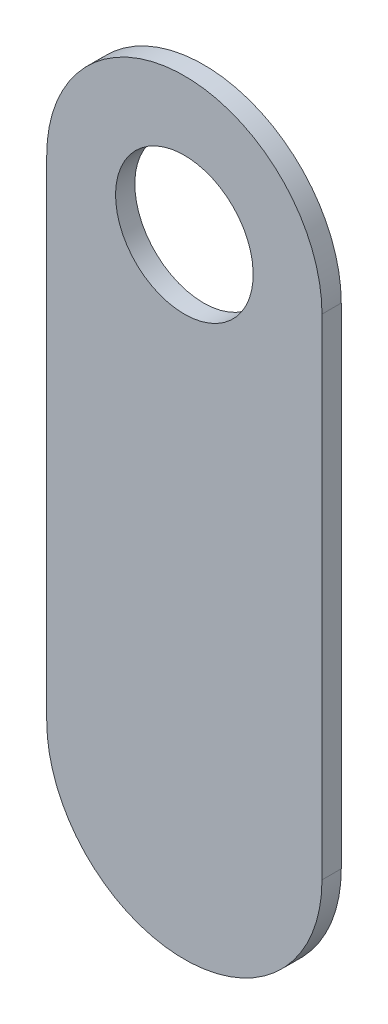
ISO-10303-21;
HEADER;
FILE_DESCRIPTION(('STEP AP214'),'2;1');
FILE_NAME('part.step','',(''),(''),'','','');
FILE_SCHEMA(('AUTOMOTIVE_DESIGN { 1 0 10303 214 1 1 1 1 }'));
ENDSEC;
DATA;
#1=APPLICATION_CONTEXT('core data for automotive mechanical design processes');
#2=APPLICATION_PROTOCOL_DEFINITION('international standard','automotive_design',2000,#1);
#3=PRODUCT_CONTEXT('',#1,'mechanical');
#4=PRODUCT('Part','Part','',(#3));
#5=PRODUCT_RELATED_PRODUCT_CATEGORY('part','',(#4));
#6=PRODUCT_DEFINITION_FORMATION('','',#4);
#7=PRODUCT_DEFINITION_CONTEXT('part definition',#1,'design');
#8=PRODUCT_DEFINITION('design','',#6,#7);
#9=PRODUCT_DEFINITION_SHAPE('','',#8);
#10=(LENGTH_UNIT() NAMED_UNIT(*) SI_UNIT(.MILLI.,.METRE.));
#11=(NAMED_UNIT(*) PLANE_ANGLE_UNIT() SI_UNIT($,.RADIAN.));
#12=(NAMED_UNIT(*) SI_UNIT($,.STERADIAN.) SOLID_ANGLE_UNIT());
#13=UNCERTAINTY_MEASURE_WITH_UNIT(LENGTH_MEASURE(1.E-05),#10,'distance_accuracy_value','');
#14=(GEOMETRIC_REPRESENTATION_CONTEXT(3) GLOBAL_UNCERTAINTY_ASSIGNED_CONTEXT((#13)) GLOBAL_UNIT_ASSIGNED_CONTEXT((#10,
#11,#12)) REPRESENTATION_CONTEXT('',''));
#15=CARTESIAN_POINT('',(0.,0.,0.));
#16=DIRECTION('',(0.,0.,1.));
#17=DIRECTION('',(1.,0.,0.));
#18=AXIS2_PLACEMENT_3D('',#15,#16,#17);
#19=CARTESIAN_POINT('',(78.07,-109.24,-0.045));
#20=DIRECTION('',(0.,0.,-1.));
#21=DIRECTION('',(0.,-1.,0.));
#22=AXIS2_PLACEMENT_3D('',#19,#20,#21);
#23=CYLINDRICAL_SURFACE('',#22,0.125);
#24=CARTESIAN_POINT('',(78.07,-109.24,1.6));
#25=DIRECTION('',(0.,0.,-1.));
#26=DIRECTION('',(0.,-1.,0.));
#27=AXIS2_PLACEMENT_3D('',#24,#25,#26);
#28=CIRCLE('',#27,0.125);
#29=CARTESIAN_POINT('',(78.07,-109.365,1.6));
#30=VERTEX_POINT('',#29);
#31=EDGE_CURVE('E127',#30,#30,#28,.T.);
#32=ORIENTED_EDGE('',*,*,#31,.T.);
#33=DIRECTION('',(0.,0.,1.));
#34=VECTOR('',#33,1.);
#35=CARTESIAN_POINT('',(78.07,-109.365,-0.045));
#36=LINE('',#35,#34);
#37=CARTESIAN_POINT('',(78.07,-109.365,1.635));
#38=VERTEX_POINT('',#37);
#39=EDGE_CURVE('E11',#30,#38,#36,.T.);
#40=ORIENTED_EDGE('',*,*,#39,.T.);
#41=CARTESIAN_POINT('',(78.07,-109.24,1.635));
#42=DIRECTION('',(0.,0.,-1.));
#43=DIRECTION('',(0.,-1.,0.));
#44=AXIS2_PLACEMENT_3D('',#41,#42,#43);
#45=CIRCLE('',#44,0.125);
#46=EDGE_CURVE('E21',#38,#38,#45,.T.);
#47=ORIENTED_EDGE('',*,*,#46,.F.);
#48=ORIENTED_EDGE('',*,*,#39,.F.);
#49=EDGE_LOOP('',(#32,#40,#47,#48));
#50=FACE_BOUND('',#49,.T.);
#51=ADVANCED_FACE('F17',(#50),#23,.F.);
#52=CARTESIAN_POINT('',(77.82,-109.24,1.6));
#53=DIRECTION('',(1.,0.,0.));
#54=DIRECTION('',(0.,1.,0.));
#55=AXIS2_PLACEMENT_3D('',#52,#53,#54);
#56=PLANE('',#55);
#57=DIRECTION('',(0.,-1.,0.));
#58=VECTOR('',#57,1.);
#59=CARTESIAN_POINT('',(77.82,-109.24,1.6));
#60=LINE('',#59,#58);
#61=CARTESIAN_POINT('',(77.82,-109.24,1.6));
#62=VERTEX_POINT('',#61);
#63=CARTESIAN_POINT('',(77.82,-110.13,1.6));
#64=VERTEX_POINT('',#63);
#65=EDGE_CURVE('E59',#62,#64,#60,.T.);
#66=ORIENTED_EDGE('',*,*,#65,.T.);
#67=DIRECTION('',(0.,0.,1.));
#68=VECTOR('',#67,1.);
#69=CARTESIAN_POINT('',(77.82,-110.13,1.6));
#70=LINE('',#69,#68);
#71=CARTESIAN_POINT('',(77.82,-110.13,1.635));
#72=VERTEX_POINT('',#71);
#73=EDGE_CURVE('E93',#64,#72,#70,.T.);
#74=ORIENTED_EDGE('',*,*,#73,.T.);
#75=DIRECTION('',(0.,-1.,0.));
#76=VECTOR('',#75,1.);
#77=CARTESIAN_POINT('',(77.82,-109.24,1.635));
#78=LINE('',#77,#76);
#79=CARTESIAN_POINT('',(77.82,-109.24,1.635));
#80=VERTEX_POINT('',#79);
#81=EDGE_CURVE('E68',#80,#72,#78,.T.);
#82=ORIENTED_EDGE('',*,*,#81,.F.);
#83=DIRECTION('',(0.,0.,1.));
#84=VECTOR('',#83,1.);
#85=CARTESIAN_POINT('',(77.82,-109.24,1.6));
#86=LINE('',#85,#84);
#87=EDGE_CURVE('E92',#62,#80,#86,.T.);
#88=ORIENTED_EDGE('',*,*,#87,.F.);
#89=EDGE_LOOP('',(#66,#74,#82,#88));
#90=FACE_BOUND('',#89,.T.);
#91=ADVANCED_FACE('F19',(#90),#56,.F.);
#92=CARTESIAN_POINT('',(78.32,-110.13,1.635));
#93=DIRECTION('',(0.,0.,1.));
#94=DIRECTION('',(1.,0.,0.));
#95=AXIS2_PLACEMENT_3D('',#92,#93,#94);
#96=PLANE('',#95);
#97=ORIENTED_EDGE('',*,*,#46,.T.);
#98=EDGE_LOOP('',(#97));
#99=FACE_BOUND('',#98,.T.);
#100=DIRECTION('',(0.,1.,0.));
#101=VECTOR('',#100,1.);
#102=CARTESIAN_POINT('',(78.32,-110.13,1.635));
#103=LINE('',#102,#101);
#104=CARTESIAN_POINT('',(78.32,-110.13,1.635));
#105=VERTEX_POINT('',#104);
#106=CARTESIAN_POINT('',(78.32,-109.24,1.635));
#107=VERTEX_POINT('',#106);
#108=EDGE_CURVE('E103',#105,#107,#103,.T.);
#109=ORIENTED_EDGE('',*,*,#108,.T.);
#110=CARTESIAN_POINT('',(78.07,-109.24,1.635));
#111=DIRECTION('',(0.,0.,1.));
#112=DIRECTION('',(1.,0.,0.));
#113=AXIS2_PLACEMENT_3D('',#110,#111,#112);
#114=CIRCLE('',#113,0.25);
#115=EDGE_CURVE('E98',#107,#80,#114,.T.);
#116=ORIENTED_EDGE('',*,*,#115,.T.);
#117=ORIENTED_EDGE('',*,*,#81,.T.);
#118=CARTESIAN_POINT('',(78.07,-110.13,1.635));
#119=DIRECTION('',(0.,0.,1.));
#120=DIRECTION('',(-1.,0.,0.));
#121=AXIS2_PLACEMENT_3D('',#118,#119,#120);
#122=CIRCLE('',#121,0.25);
#123=EDGE_CURVE('E118',#72,#105,#122,.T.);
#124=ORIENTED_EDGE('',*,*,#123,.T.);
#125=EDGE_LOOP('',(#109,#116,#117,#124));
#126=FACE_BOUND('',#125,.T.);
#127=ADVANCED_FACE('F137',(#99,#126),#96,.T.);
#128=CARTESIAN_POINT('',(78.32,-110.13,1.6));
#129=DIRECTION('',(0.,0.,1.));
#130=DIRECTION('',(1.,0.,0.));
#131=AXIS2_PLACEMENT_3D('',#128,#129,#130);
#132=PLANE('',#131);
#133=ORIENTED_EDGE('',*,*,#31,.F.);
#134=EDGE_LOOP('',(#133));
#135=FACE_BOUND('',#134,.T.);
#136=CARTESIAN_POINT('',(78.07,-110.13,1.6));
#137=DIRECTION('',(0.,0.,1.));
#138=DIRECTION('',(-1.,0.,0.));
#139=AXIS2_PLACEMENT_3D('',#136,#137,#138);
#140=CIRCLE('',#139,0.25);
#141=CARTESIAN_POINT('',(78.32,-110.13,1.6));
#142=VERTEX_POINT('',#141);
#143=EDGE_CURVE('E121',#64,#142,#140,.T.);
#144=ORIENTED_EDGE('',*,*,#143,.F.);
#145=ORIENTED_EDGE('',*,*,#65,.F.);
#146=CARTESIAN_POINT('',(78.07,-109.24,1.6));
#147=DIRECTION('',(0.,0.,1.));
#148=DIRECTION('',(1.,0.,0.));
#149=AXIS2_PLACEMENT_3D('',#146,#147,#148);
#150=CIRCLE('',#149,0.25);
#151=CARTESIAN_POINT('',(78.32,-109.24,1.6));
#152=VERTEX_POINT('',#151);
#153=EDGE_CURVE('E84',#152,#62,#150,.T.);
#154=ORIENTED_EDGE('',*,*,#153,.F.);
#155=DIRECTION('',(0.,1.,0.));
#156=VECTOR('',#155,1.);
#157=CARTESIAN_POINT('',(78.32,-110.13,1.6));
#158=LINE('',#157,#156);
#159=EDGE_CURVE('E88',#142,#152,#158,.T.);
#160=ORIENTED_EDGE('',*,*,#159,.F.);
#161=EDGE_LOOP('',(#144,#145,#154,#160));
#162=FACE_BOUND('',#161,.T.);
#163=ADVANCED_FACE('F86',(#135,#162),#132,.F.);
#164=CARTESIAN_POINT('',(78.07,-109.24,1.6));
#165=DIRECTION('',(0.,0.,-1.));
#166=DIRECTION('',(1.,0.,0.));
#167=AXIS2_PLACEMENT_3D('',#164,#165,#166);
#168=CYLINDRICAL_SURFACE('',#167,0.25);
#169=ORIENTED_EDGE('',*,*,#153,.T.);
#170=ORIENTED_EDGE('',*,*,#87,.T.);
#171=ORIENTED_EDGE('',*,*,#115,.F.);
#172=DIRECTION('',(0.,0.,1.));
#173=VECTOR('',#172,1.);
#174=CARTESIAN_POINT('',(78.32,-109.24,1.6));
#175=LINE('',#174,#173);
#176=EDGE_CURVE('E96',#152,#107,#175,.T.);
#177=ORIENTED_EDGE('',*,*,#176,.F.);
#178=EDGE_LOOP('',(#169,#170,#171,#177));
#179=FACE_BOUND('',#178,.T.);
#180=ADVANCED_FACE('F97',(#179),#168,.T.);
#181=CARTESIAN_POINT('',(78.07,-110.13,1.6));
#182=DIRECTION('',(0.,0.,-1.));
#183=DIRECTION('',(-1.,0.,0.));
#184=AXIS2_PLACEMENT_3D('',#181,#182,#183);
#185=CYLINDRICAL_SURFACE('',#184,0.25);
#186=ORIENTED_EDGE('',*,*,#143,.T.);
#187=DIRECTION('',(0.,0.,1.));
#188=VECTOR('',#187,1.);
#189=CARTESIAN_POINT('',(78.32,-110.13,1.6));
#190=LINE('',#189,#188);
#191=EDGE_CURVE('E108',#142,#105,#190,.T.);
#192=ORIENTED_EDGE('',*,*,#191,.T.);
#193=ORIENTED_EDGE('',*,*,#123,.F.);
#194=ORIENTED_EDGE('',*,*,#73,.F.);
#195=EDGE_LOOP('',(#186,#192,#193,#194));
#196=FACE_BOUND('',#195,.T.);
#197=ADVANCED_FACE('F143',(#196),#185,.T.);
#198=CARTESIAN_POINT('',(78.32,-110.13,1.6));
#199=DIRECTION('',(-1.,0.,0.));
#200=DIRECTION('',(0.,0.,1.));
#201=AXIS2_PLACEMENT_3D('',#198,#199,#200);
#202=PLANE('',#201);
#203=ORIENTED_EDGE('',*,*,#159,.T.);
#204=ORIENTED_EDGE('',*,*,#176,.T.);
#205=ORIENTED_EDGE('',*,*,#108,.F.);
#206=ORIENTED_EDGE('',*,*,#191,.F.);
#207=EDGE_LOOP('',(#203,#204,#205,#206));
#208=FACE_BOUND('',#207,.T.);
#209=ADVANCED_FACE('F106',(#208),#202,.F.);
#210=CLOSED_SHELL('',(#51,#91,#127,#163,#180,#197,#209));
#211=MANIFOLD_SOLID_BREP('B1',#210);
#212=ADVANCED_BREP_SHAPE_REPRESENTATION('',(#18,#211),#14);
#213=SHAPE_DEFINITION_REPRESENTATION(#9,#212);
ENDSEC;
END-ISO-10303-21;
